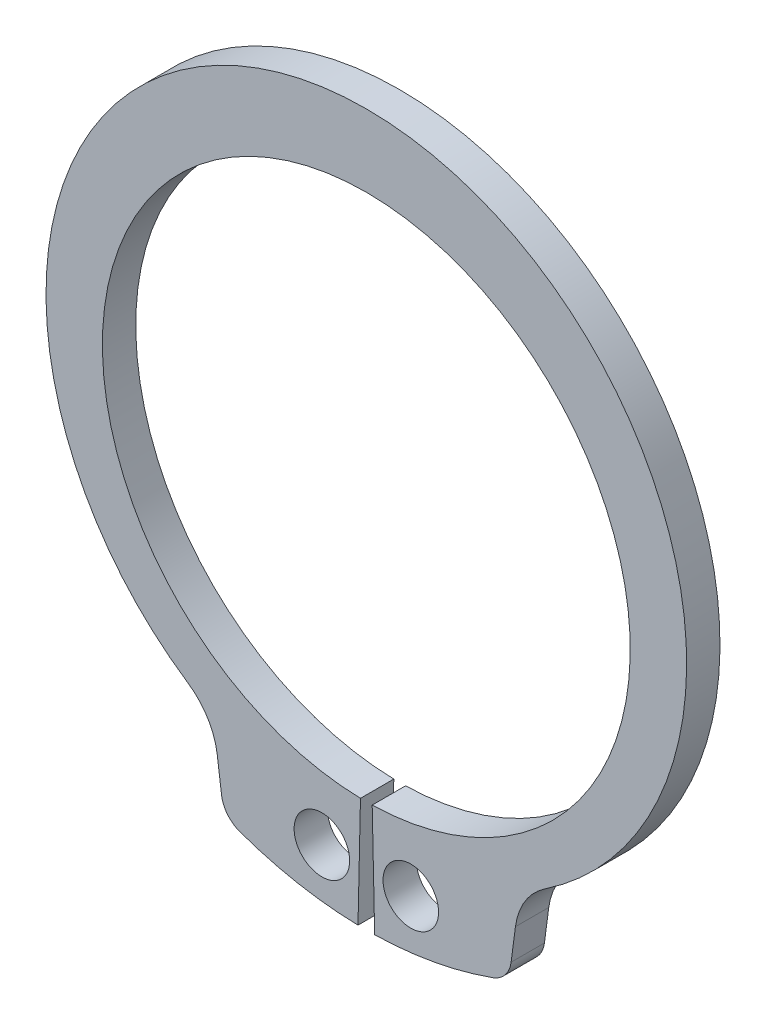
ISO-10303-21;
HEADER;
FILE_DESCRIPTION(('STEP AP214'),'2;1');
FILE_NAME('part.step','',(''),(''),'','','');
FILE_SCHEMA(('AUTOMOTIVE_DESIGN { 1 0 10303 214 1 1 1 1 }'));
ENDSEC;
DATA;
#1=APPLICATION_CONTEXT('core data for automotive mechanical design processes');
#2=APPLICATION_PROTOCOL_DEFINITION('international standard','automotive_design',2000,#1);
#3=PRODUCT_CONTEXT('',#1,'mechanical');
#4=PRODUCT('Part','Part','',(#3));
#5=PRODUCT_RELATED_PRODUCT_CATEGORY('part','',(#4));
#6=PRODUCT_DEFINITION_FORMATION('','',#4);
#7=PRODUCT_DEFINITION_CONTEXT('part definition',#1,'design');
#8=PRODUCT_DEFINITION('design','',#6,#7);
#9=PRODUCT_DEFINITION_SHAPE('','',#8);
#10=(LENGTH_UNIT() NAMED_UNIT(*) SI_UNIT(.MILLI.,.METRE.));
#11=(NAMED_UNIT(*) PLANE_ANGLE_UNIT() SI_UNIT($,.RADIAN.));
#12=(NAMED_UNIT(*) SI_UNIT($,.STERADIAN.) SOLID_ANGLE_UNIT());
#13=UNCERTAINTY_MEASURE_WITH_UNIT(LENGTH_MEASURE(1.E-05),#10,'distance_accuracy_value','');
#14=(GEOMETRIC_REPRESENTATION_CONTEXT(3) GLOBAL_UNCERTAINTY_ASSIGNED_CONTEXT((#13)) GLOBAL_UNIT_ASSIGNED_CONTEXT((#10,
#11,#12)) REPRESENTATION_CONTEXT('',''));
#15=CARTESIAN_POINT('',(0.,0.,0.));
#16=DIRECTION('',(0.,0.,1.));
#17=DIRECTION('',(1.,0.,0.));
#18=AXIS2_PLACEMENT_3D('',#15,#16,#17);
#19=CARTESIAN_POINT('',(0.,0.,-1.2));
#20=DIRECTION('',(0.,0.,1.));
#21=DIRECTION('',(1.,0.,0.));
#22=AXIS2_PLACEMENT_3D('',#19,#20,#21);
#23=CYLINDRICAL_SURFACE('',#22,9.5);
#24=CARTESIAN_POINT('',(0.,0.,0.));
#25=DIRECTION('',(0.,0.,-1.));
#26=DIRECTION('',(1.,0.,0.));
#27=AXIS2_PLACEMENT_3D('',#24,#25,#26);
#28=CIRCLE('',#27,9.5);
#29=CARTESIAN_POINT('',(-0.211111111111106,-9.49765403132613,0.));
#30=VERTEX_POINT('',#29);
#31=CARTESIAN_POINT('',(0.211111111111106,-9.49765403132613,0.));
#32=VERTEX_POINT('',#31);
#33=EDGE_CURVE('E157',#30,#32,#28,.T.);
#34=ORIENTED_EDGE('',*,*,#33,.F.);
#35=DIRECTION('',(0.,0.,1.));
#36=VECTOR('',#35,1.);
#37=CARTESIAN_POINT('',(-0.211111111111106,-9.49765403132613,-1.2));
#38=LINE('',#37,#36);
#39=CARTESIAN_POINT('',(-0.211111111111106,-9.49765403132613,-1.2));
#40=VERTEX_POINT('',#39);
#41=EDGE_CURVE('E11',#40,#30,#38,.T.);
#42=ORIENTED_EDGE('',*,*,#41,.F.);
#43=CARTESIAN_POINT('',(0.,0.,-1.2));
#44=DIRECTION('',(0.,0.,-1.));
#45=DIRECTION('',(1.,0.,0.));
#46=AXIS2_PLACEMENT_3D('',#43,#44,#45);
#47=CIRCLE('',#46,9.5);
#48=CARTESIAN_POINT('',(0.211111111111106,-9.49765403132613,-1.2));
#49=VERTEX_POINT('',#48);
#50=EDGE_CURVE('E190',#40,#49,#47,.T.);
#51=ORIENTED_EDGE('',*,*,#50,.T.);
#52=DIRECTION('',(0.,0.,1.));
#53=VECTOR('',#52,1.);
#54=CARTESIAN_POINT('',(0.211111111111106,-9.49765403132613,-1.2));
#55=LINE('',#54,#53);
#56=EDGE_CURVE('E39',#49,#32,#55,.T.);
#57=ORIENTED_EDGE('',*,*,#56,.T.);
#58=EDGE_LOOP('',(#34,#42,#51,#57));
#59=FACE_BOUND('',#58,.T.);
#60=ADVANCED_FACE('F36',(#59),#23,.F.);
#61=CARTESIAN_POINT('',(-0.211111111111106,-9.49765403132613,-1.2));
#62=DIRECTION('',(0.999753055929066,-0.0222222222222222,0.));
#63=DIRECTION('',(0.0222222222222222,0.999753055929066,0.));
#64=AXIS2_PLACEMENT_3D('',#61,#62,#63);
#65=PLANE('',#64);
#66=DIRECTION('',(0.0222222222222222,0.999753055929066,0.));
#67=VECTOR('',#66,1.);
#68=CARTESIAN_POINT('',(-0.211111111111106,-9.49765403132613,0.));
#69=LINE('',#68,#67);
#70=CARTESIAN_POINT('',(-0.299999999999995,-13.4966662550424,0.));
#71=VERTEX_POINT('',#70);
#72=EDGE_CURVE('E188',#71,#30,#69,.T.);
#73=ORIENTED_EDGE('',*,*,#72,.F.);
#74=DIRECTION('',(0.,0.,1.));
#75=VECTOR('',#74,1.);
#76=CARTESIAN_POINT('',(-0.299999999999995,-13.4966662550424,-1.2));
#77=LINE('',#76,#75);
#78=CARTESIAN_POINT('',(-0.299999999999995,-13.4966662550424,-1.2));
#79=VERTEX_POINT('',#78);
#80=EDGE_CURVE('E45',#79,#71,#77,.T.);
#81=ORIENTED_EDGE('',*,*,#80,.F.);
#82=DIRECTION('',(0.0222222222222222,0.999753055929066,0.));
#83=VECTOR('',#82,1.);
#84=CARTESIAN_POINT('',(-0.211111111111106,-9.49765403132613,-1.2));
#85=LINE('',#84,#83);
#86=EDGE_CURVE('E147',#79,#40,#85,.T.);
#87=ORIENTED_EDGE('',*,*,#86,.T.);
#88=ORIENTED_EDGE('',*,*,#41,.T.);
#89=EDGE_LOOP('',(#73,#81,#87,#88));
#90=FACE_BOUND('',#89,.T.);
#91=ADVANCED_FACE('F210',(#90),#65,.T.);
#92=CARTESIAN_POINT('',(0.,0.,-1.2));
#93=DIRECTION('',(0.,0.,1.));
#94=DIRECTION('',(1.,0.,0.));
#95=AXIS2_PLACEMENT_3D('',#92,#93,#94);
#96=CYLINDRICAL_SURFACE('',#95,13.5);
#97=CARTESIAN_POINT('',(0.,0.,0.));
#98=DIRECTION('',(0.,0.,1.));
#99=DIRECTION('',(1.,0.,0.));
#100=AXIS2_PLACEMENT_3D('',#97,#98,#99);
#101=CIRCLE('',#100,13.5);
#102=CARTESIAN_POINT('',(-4.55698289544468,-12.7076318364448,0.));
#103=VERTEX_POINT('',#102);
#104=EDGE_CURVE('E134',#103,#71,#101,.T.);
#105=ORIENTED_EDGE('',*,*,#104,.F.);
#106=DIRECTION('',(0.,0.,1.));
#107=VECTOR('',#106,1.);
#108=CARTESIAN_POINT('',(-4.55698289544468,-12.7076318364448,-1.2));
#109=LINE('',#108,#107);
#110=CARTESIAN_POINT('',(-4.55698289544468,-12.7076318364448,-1.2));
#111=VERTEX_POINT('',#110);
#112=EDGE_CURVE('E129',#111,#103,#109,.T.);
#113=ORIENTED_EDGE('',*,*,#112,.F.);
#114=CARTESIAN_POINT('',(0.,0.,-1.2));
#115=DIRECTION('',(0.,0.,1.));
#116=DIRECTION('',(1.,0.,0.));
#117=AXIS2_PLACEMENT_3D('',#114,#115,#116);
#118=CIRCLE('',#117,13.5);
#119=EDGE_CURVE('E132',#111,#79,#118,.T.);
#120=ORIENTED_EDGE('',*,*,#119,.T.);
#121=ORIENTED_EDGE('',*,*,#80,.T.);
#122=EDGE_LOOP('',(#105,#113,#120,#121));
#123=FACE_BOUND('',#122,.T.);
#124=ADVANCED_FACE('F131',(#123),#96,.T.);
#125=CARTESIAN_POINT('',(-4.21942860689323,-11.7663257744859,-1.2));
#126=DIRECTION('',(0.,0.,1.));
#127=DIRECTION('',(1.,0.,0.));
#128=AXIS2_PLACEMENT_3D('',#125,#126,#127);
#129=CYLINDRICAL_SURFACE('',#128,0.999999999999998);
#130=CARTESIAN_POINT('',(-4.21942860689323,-11.7663257744859,0.));
#131=DIRECTION('',(0.,0.,1.));
#132=DIRECTION('',(1.,0.,0.));
#133=AXIS2_PLACEMENT_3D('',#130,#131,#132);
#134=CIRCLE('',#133,0.999999999999998);
#135=CARTESIAN_POINT('',(-5.21087346826704,-11.896851966706,0.));
#136=VERTEX_POINT('',#135);
#137=EDGE_CURVE('E185',#136,#103,#134,.T.);
#138=ORIENTED_EDGE('',*,*,#137,.F.);
#139=DIRECTION('',(0.,0.,1.));
#140=VECTOR('',#139,1.);
#141=CARTESIAN_POINT('',(-5.21087346826704,-11.896851966706,-1.2));
#142=LINE('',#141,#140);
#143=CARTESIAN_POINT('',(-5.21087346826704,-11.896851966706,-1.2));
#144=VERTEX_POINT('',#143);
#145=EDGE_CURVE('E139',#144,#136,#142,.T.);
#146=ORIENTED_EDGE('',*,*,#145,.F.);
#147=CARTESIAN_POINT('',(-4.21942860689323,-11.7663257744859,-1.2));
#148=DIRECTION('',(0.,0.,1.));
#149=DIRECTION('',(1.,0.,0.));
#150=AXIS2_PLACEMENT_3D('',#147,#148,#149);
#151=CIRCLE('',#150,0.999999999999998);
#152=EDGE_CURVE('E145',#144,#111,#151,.T.);
#153=ORIENTED_EDGE('',*,*,#152,.T.);
#154=ORIENTED_EDGE('',*,*,#112,.T.);
#155=EDGE_LOOP('',(#138,#146,#153,#154));
#156=FACE_BOUND('',#155,.T.);
#157=ADVANCED_FACE('F149',(#156),#129,.T.);
#158=CARTESIAN_POINT('',(-5.36704769711022,-10.7105909256687,-1.2));
#159=DIRECTION('',(-0.99144486137381,-0.13052619222005,0.));
#160=DIRECTION('',(0.13052619222005,-0.991444861373811,0.));
#161=AXIS2_PLACEMENT_3D('',#158,#159,#160);
#162=PLANE('',#161);
#163=DIRECTION('',(0.13052619222005,-0.991444861373811,0.));
#164=VECTOR('',#163,1.);
#165=CARTESIAN_POINT('',(-5.36704769711022,-10.7105909256687,0.));
#166=LINE('',#165,#164);
#167=CARTESIAN_POINT('',(-5.36704769711022,-10.7105909256687,0.));
#168=VERTEX_POINT('',#167);
#169=EDGE_CURVE('E182',#168,#136,#166,.T.);
#170=ORIENTED_EDGE('',*,*,#169,.F.);
#171=DIRECTION('',(0.,0.,1.));
#172=VECTOR('',#171,1.);
#173=CARTESIAN_POINT('',(-5.36704769711022,-10.7105909256687,-1.2));
#174=LINE('',#173,#172);
#175=CARTESIAN_POINT('',(-5.36704769711022,-10.7105909256687,-1.2));
#176=VERTEX_POINT('',#175);
#177=EDGE_CURVE('E194',#176,#168,#174,.T.);
#178=ORIENTED_EDGE('',*,*,#177,.F.);
#179=DIRECTION('',(0.13052619222005,-0.991444861373811,0.));
#180=VECTOR('',#179,1.);
#181=CARTESIAN_POINT('',(-5.36704769711022,-10.7105909256687,-1.2));
#182=LINE('',#181,#180);
#183=EDGE_CURVE('E150',#176,#144,#182,.T.);
#184=ORIENTED_EDGE('',*,*,#183,.T.);
#185=ORIENTED_EDGE('',*,*,#145,.T.);
#186=EDGE_LOOP('',(#170,#178,#184,#185));
#187=FACE_BOUND('',#186,.T.);
#188=ADVANCED_FACE('F223',(#187),#162,.T.);
#189=CARTESIAN_POINT('',(-7.78536213111475,-11.028968060857,-1.2));
#190=DIRECTION('',(0.,0.,1.));
#191=DIRECTION('',(1.,0.,0.));
#192=AXIS2_PLACEMENT_3D('',#189,#190,#191);
#193=CYLINDRICAL_SURFACE('',#192,2.43918197392597);
#194=CARTESIAN_POINT('',(-7.78536213111475,-11.028968060857,0.));
#195=DIRECTION('',(0.,0.,-1.));
#196=DIRECTION('',(1.,0.,0.));
#197=AXIS2_PLACEMENT_3D('',#194,#195,#196);
#198=CIRCLE('',#197,2.43918197392597);
#199=CARTESIAN_POINT('',(-6.42596596916006,-9.00371479847517,0.));
#200=VERTEX_POINT('',#199);
#201=EDGE_CURVE('E179',#200,#168,#198,.T.);
#202=ORIENTED_EDGE('',*,*,#201,.F.);
#203=DIRECTION('',(0.,0.,1.));
#204=VECTOR('',#203,1.);
#205=CARTESIAN_POINT('',(-6.42596596916006,-9.00371479847517,-1.2));
#206=LINE('',#205,#204);
#207=CARTESIAN_POINT('',(-6.42596596916006,-9.00371479847517,-1.2));
#208=VERTEX_POINT('',#207);
#209=EDGE_CURVE('E196',#208,#200,#206,.T.);
#210=ORIENTED_EDGE('',*,*,#209,.F.);
#211=CARTESIAN_POINT('',(-7.78536213111475,-11.028968060857,-1.2));
#212=DIRECTION('',(0.,0.,-1.));
#213=DIRECTION('',(1.,0.,0.));
#214=AXIS2_PLACEMENT_3D('',#211,#212,#213);
#215=CIRCLE('',#214,2.43918197392597);
#216=EDGE_CURVE('E152',#208,#176,#215,.T.);
#217=ORIENTED_EDGE('',*,*,#216,.T.);
#218=ORIENTED_EDGE('',*,*,#177,.T.);
#219=EDGE_LOOP('',(#202,#210,#217,#218));
#220=FACE_BOUND('',#219,.T.);
#221=ADVANCED_FACE('F226',(#220),#193,.F.);
#222=CARTESIAN_POINT('',(0.,0.569806818860485,-1.2));
#223=DIRECTION('',(0.,0.,1.));
#224=DIRECTION('',(1.,0.,0.));
#225=AXIS2_PLACEMENT_3D('',#222,#223,#224);
#226=CYLINDRICAL_SURFACE('',#225,11.5301931811395);
#227=CARTESIAN_POINT('',(0.,0.569806818860485,0.));
#228=DIRECTION('',(0.,0.,1.));
#229=DIRECTION('',(1.,0.,0.));
#230=AXIS2_PLACEMENT_3D('',#227,#228,#229);
#231=CIRCLE('',#230,11.5301931811395);
#232=CARTESIAN_POINT('',(6.42596596916006,-9.00371479847517,0.));
#233=VERTEX_POINT('',#232);
#234=EDGE_CURVE('E176',#233,#200,#231,.T.);
#235=ORIENTED_EDGE('',*,*,#234,.F.);
#236=DIRECTION('',(0.,0.,1.));
#237=VECTOR('',#236,1.);
#238=CARTESIAN_POINT('',(6.42596596916006,-9.00371479847517,-1.2));
#239=LINE('',#238,#237);
#240=CARTESIAN_POINT('',(6.42596596916006,-9.00371479847517,-1.2));
#241=VERTEX_POINT('',#240);
#242=EDGE_CURVE('E198',#241,#233,#239,.T.);
#243=ORIENTED_EDGE('',*,*,#242,.F.);
#244=CARTESIAN_POINT('',(0.,0.569806818860485,-1.2));
#245=DIRECTION('',(0.,0.,1.));
#246=DIRECTION('',(1.,0.,0.));
#247=AXIS2_PLACEMENT_3D('',#244,#245,#246);
#248=CIRCLE('',#247,11.5301931811395);
#249=EDGE_CURVE('E300',#241,#208,#248,.T.);
#250=ORIENTED_EDGE('',*,*,#249,.T.);
#251=ORIENTED_EDGE('',*,*,#209,.T.);
#252=EDGE_LOOP('',(#235,#243,#250,#251));
#253=FACE_BOUND('',#252,.T.);
#254=ADVANCED_FACE('F230',(#253),#226,.T.);
#255=CARTESIAN_POINT('',(7.78536213111475,-11.028968060857,-1.2));
#256=DIRECTION('',(0.,0.,1.));
#257=DIRECTION('',(1.,0.,0.));
#258=AXIS2_PLACEMENT_3D('',#255,#256,#257);
#259=CYLINDRICAL_SURFACE('',#258,2.43918197392597);
#260=CARTESIAN_POINT('',(7.78536213111475,-11.028968060857,0.));
#261=DIRECTION('',(0.,0.,-1.));
#262=DIRECTION('',(1.,0.,0.));
#263=AXIS2_PLACEMENT_3D('',#260,#261,#262);
#264=CIRCLE('',#263,2.43918197392597);
#265=CARTESIAN_POINT('',(5.36704769711022,-10.7105909256687,0.));
#266=VERTEX_POINT('',#265);
#267=EDGE_CURVE('E173',#266,#233,#264,.T.);
#268=ORIENTED_EDGE('',*,*,#267,.F.);
#269=DIRECTION('',(0.,0.,1.));
#270=VECTOR('',#269,1.);
#271=CARTESIAN_POINT('',(5.36704769711022,-10.7105909256687,-1.2));
#272=LINE('',#271,#270);
#273=CARTESIAN_POINT('',(5.36704769711022,-10.7105909256687,-1.2));
#274=VERTEX_POINT('',#273);
#275=EDGE_CURVE('E200',#274,#266,#272,.T.);
#276=ORIENTED_EDGE('',*,*,#275,.F.);
#277=CARTESIAN_POINT('',(7.78536213111475,-11.028968060857,-1.2));
#278=DIRECTION('',(0.,0.,-1.));
#279=DIRECTION('',(1.,0.,0.));
#280=AXIS2_PLACEMENT_3D('',#277,#278,#279);
#281=CIRCLE('',#280,2.43918197392597);
#282=EDGE_CURVE('E297',#274,#241,#281,.T.);
#283=ORIENTED_EDGE('',*,*,#282,.T.);
#284=ORIENTED_EDGE('',*,*,#242,.T.);
#285=EDGE_LOOP('',(#268,#276,#283,#284));
#286=FACE_BOUND('',#285,.T.);
#287=ADVANCED_FACE('F234',(#286),#259,.F.);
#288=CARTESIAN_POINT('',(5.36704769711022,-10.7105909256687,-1.2));
#289=DIRECTION('',(0.99144486137381,-0.13052619222005,0.));
#290=DIRECTION('',(0.13052619222005,0.991444861373811,0.));
#291=AXIS2_PLACEMENT_3D('',#288,#289,#290);
#292=PLANE('',#291);
#293=DIRECTION('',(0.13052619222005,0.991444861373811,0.));
#294=VECTOR('',#293,1.);
#295=CARTESIAN_POINT('',(5.36704769711022,-10.7105909256687,0.));
#296=LINE('',#295,#294);
#297=CARTESIAN_POINT('',(5.21087346826704,-11.896851966706,0.));
#298=VERTEX_POINT('',#297);
#299=EDGE_CURVE('E170',#298,#266,#296,.T.);
#300=ORIENTED_EDGE('',*,*,#299,.F.);
#301=DIRECTION('',(0.,0.,1.));
#302=VECTOR('',#301,1.);
#303=CARTESIAN_POINT('',(5.21087346826704,-11.896851966706,-1.2));
#304=LINE('',#303,#302);
#305=CARTESIAN_POINT('',(5.21087346826704,-11.896851966706,-1.2));
#306=VERTEX_POINT('',#305);
#307=EDGE_CURVE('E202',#306,#298,#304,.T.);
#308=ORIENTED_EDGE('',*,*,#307,.F.);
#309=DIRECTION('',(0.13052619222005,0.991444861373811,0.));
#310=VECTOR('',#309,1.);
#311=CARTESIAN_POINT('',(5.36704769711022,-10.7105909256687,-1.2));
#312=LINE('',#311,#310);
#313=EDGE_CURVE('E294',#306,#274,#312,.T.);
#314=ORIENTED_EDGE('',*,*,#313,.T.);
#315=ORIENTED_EDGE('',*,*,#275,.T.);
#316=EDGE_LOOP('',(#300,#308,#314,#315));
#317=FACE_BOUND('',#316,.T.);
#318=ADVANCED_FACE('F238',(#317),#292,.T.);
#319=CARTESIAN_POINT('',(4.21942860689323,-11.7663257744859,-1.2));
#320=DIRECTION('',(0.,0.,1.));
#321=DIRECTION('',(1.,0.,0.));
#322=AXIS2_PLACEMENT_3D('',#319,#320,#321);
#323=CYLINDRICAL_SURFACE('',#322,0.999999999999998);
#324=CARTESIAN_POINT('',(4.21942860689323,-11.7663257744859,0.));
#325=DIRECTION('',(0.,0.,1.));
#326=DIRECTION('',(-1.,0.,0.));
#327=AXIS2_PLACEMENT_3D('',#324,#325,#326);
#328=CIRCLE('',#327,0.999999999999998);
#329=CARTESIAN_POINT('',(4.55698289544468,-12.7076318364448,0.));
#330=VERTEX_POINT('',#329);
#331=EDGE_CURVE('E167',#330,#298,#328,.T.);
#332=ORIENTED_EDGE('',*,*,#331,.F.);
#333=DIRECTION('',(0.,0.,1.));
#334=VECTOR('',#333,1.);
#335=CARTESIAN_POINT('',(4.55698289544468,-12.7076318364448,-1.2));
#336=LINE('',#335,#334);
#337=CARTESIAN_POINT('',(4.55698289544468,-12.7076318364448,-1.2));
#338=VERTEX_POINT('',#337);
#339=EDGE_CURVE('E204',#338,#330,#336,.T.);
#340=ORIENTED_EDGE('',*,*,#339,.F.);
#341=CARTESIAN_POINT('',(4.21942860689323,-11.7663257744859,-1.2));
#342=DIRECTION('',(0.,0.,1.));
#343=DIRECTION('',(-1.,0.,0.));
#344=AXIS2_PLACEMENT_3D('',#341,#342,#343);
#345=CIRCLE('',#344,0.999999999999998);
#346=EDGE_CURVE('E291',#338,#306,#345,.T.);
#347=ORIENTED_EDGE('',*,*,#346,.T.);
#348=ORIENTED_EDGE('',*,*,#307,.T.);
#349=EDGE_LOOP('',(#332,#340,#347,#348));
#350=FACE_BOUND('',#349,.T.);
#351=ADVANCED_FACE('F242',(#350),#323,.T.);
#352=CARTESIAN_POINT('',(0.,0.,-1.2));
#353=DIRECTION('',(0.,0.,1.));
#354=DIRECTION('',(1.,0.,0.));
#355=AXIS2_PLACEMENT_3D('',#352,#353,#354);
#356=CYLINDRICAL_SURFACE('',#355,13.5);
#357=CARTESIAN_POINT('',(0.,0.,0.));
#358=DIRECTION('',(0.,0.,1.));
#359=DIRECTION('',(1.,0.,0.));
#360=AXIS2_PLACEMENT_3D('',#357,#358,#359);
#361=CIRCLE('',#360,13.5);
#362=CARTESIAN_POINT('',(0.299999999999995,-13.4966662550424,0.));
#363=VERTEX_POINT('',#362);
#364=EDGE_CURVE('E164',#363,#330,#361,.T.);
#365=ORIENTED_EDGE('',*,*,#364,.F.);
#366=DIRECTION('',(0.,0.,1.));
#367=VECTOR('',#366,1.);
#368=CARTESIAN_POINT('',(0.299999999999995,-13.4966662550424,-1.2));
#369=LINE('',#368,#367);
#370=CARTESIAN_POINT('',(0.299999999999995,-13.4966662550424,-1.2));
#371=VERTEX_POINT('',#370);
#372=EDGE_CURVE('E205',#371,#363,#369,.T.);
#373=ORIENTED_EDGE('',*,*,#372,.F.);
#374=CARTESIAN_POINT('',(0.,0.,-1.2));
#375=DIRECTION('',(0.,0.,1.));
#376=DIRECTION('',(1.,0.,0.));
#377=AXIS2_PLACEMENT_3D('',#374,#375,#376);
#378=CIRCLE('',#377,13.5);
#379=EDGE_CURVE('E288',#371,#338,#378,.T.);
#380=ORIENTED_EDGE('',*,*,#379,.T.);
#381=ORIENTED_EDGE('',*,*,#339,.T.);
#382=EDGE_LOOP('',(#365,#373,#380,#381));
#383=FACE_BOUND('',#382,.T.);
#384=ADVANCED_FACE('F246',(#383),#356,.T.);
#385=CARTESIAN_POINT('',(0.211111111111106,-9.49765403132613,-1.2));
#386=DIRECTION('',(-0.999753055929066,-0.0222222222222222,0.));
#387=DIRECTION('',(0.0222222222222222,-0.999753055929066,0.));
#388=AXIS2_PLACEMENT_3D('',#385,#386,#387);
#389=PLANE('',#388);
#390=DIRECTION('',(0.0222222222222222,-0.999753055929066,0.));
#391=VECTOR('',#390,1.);
#392=CARTESIAN_POINT('',(0.211111111111106,-9.49765403132613,0.));
#393=LINE('',#392,#391);
#394=EDGE_CURVE('E160',#32,#363,#393,.T.);
#395=ORIENTED_EDGE('',*,*,#394,.F.);
#396=ORIENTED_EDGE('',*,*,#56,.F.);
#397=DIRECTION('',(0.0222222222222222,-0.999753055929066,0.));
#398=VECTOR('',#397,1.);
#399=CARTESIAN_POINT('',(0.211111111111106,-9.49765403132613,-1.2));
#400=LINE('',#399,#398);
#401=EDGE_CURVE('E286',#49,#371,#400,.T.);
#402=ORIENTED_EDGE('',*,*,#401,.T.);
#403=ORIENTED_EDGE('',*,*,#372,.T.);
#404=EDGE_LOOP('',(#395,#396,#402,#403));
#405=FACE_BOUND('',#404,.T.);
#406=ADVANCED_FACE('F207',(#405),#389,.T.);
#407=CARTESIAN_POINT('',(0.,0.,-1.2));
#408=DIRECTION('',(0.,0.,1.));
#409=DIRECTION('',(1.,0.,0.));
#410=AXIS2_PLACEMENT_3D('',#407,#408,#409);
#411=PLANE('',#410);
#412=CARTESIAN_POINT('',(-1.59999999999999,-11.6405541105224,-1.2));
#413=DIRECTION('',(0.,0.,1.));
#414=DIRECTION('',(1.,0.,0.));
#415=AXIS2_PLACEMENT_3D('',#412,#413,#414);
#416=CIRCLE('',#415,1.);
#417=CARTESIAN_POINT('',(-0.59999999999999,-11.6405541105224,-1.2));
#418=VERTEX_POINT('',#417);
#419=EDGE_CURVE('E273',#418,#418,#416,.T.);
#420=ORIENTED_EDGE('',*,*,#419,.T.);
#421=EDGE_LOOP('',(#420));
#422=FACE_BOUND('',#421,.T.);
#423=CARTESIAN_POINT('',(1.59999999999999,-11.6405541105224,-1.2));
#424=DIRECTION('',(0.,0.,1.));
#425=DIRECTION('',(1.,0.,0.));
#426=AXIS2_PLACEMENT_3D('',#423,#424,#425);
#427=CIRCLE('',#426,1.);
#428=CARTESIAN_POINT('',(2.59999999999999,-11.6405541105224,-1.2));
#429=VERTEX_POINT('',#428);
#430=EDGE_CURVE('E161',#429,#429,#427,.T.);
#431=ORIENTED_EDGE('',*,*,#430,.T.);
#432=EDGE_LOOP('',(#431));
#433=FACE_BOUND('',#432,.T.);
#434=ORIENTED_EDGE('',*,*,#50,.F.);
#435=ORIENTED_EDGE('',*,*,#86,.F.);
#436=ORIENTED_EDGE('',*,*,#119,.F.);
#437=ORIENTED_EDGE('',*,*,#152,.F.);
#438=ORIENTED_EDGE('',*,*,#183,.F.);
#439=ORIENTED_EDGE('',*,*,#216,.F.);
#440=ORIENTED_EDGE('',*,*,#249,.F.);
#441=ORIENTED_EDGE('',*,*,#282,.F.);
#442=ORIENTED_EDGE('',*,*,#313,.F.);
#443=ORIENTED_EDGE('',*,*,#346,.F.);
#444=ORIENTED_EDGE('',*,*,#379,.F.);
#445=ORIENTED_EDGE('',*,*,#401,.F.);
#446=EDGE_LOOP('',(#434,#435,#436,#437,#438,#439,#440,#441,#442,#443,#444,#445));
#447=FACE_BOUND('',#446,.T.);
#448=ADVANCED_FACE('F143',(#422,#433,#447),#411,.F.);
#449=CARTESIAN_POINT('',(0.,0.,0.));
#450=DIRECTION('',(0.,0.,1.));
#451=DIRECTION('',(1.,0.,0.));
#452=AXIS2_PLACEMENT_3D('',#449,#450,#451);
#453=PLANE('',#452);
#454=CARTESIAN_POINT('',(-1.59999999999999,-11.6405541105224,0.));
#455=DIRECTION('',(0.,0.,1.));
#456=DIRECTION('',(1.,0.,0.));
#457=AXIS2_PLACEMENT_3D('',#454,#455,#456);
#458=CIRCLE('',#457,1.);
#459=CARTESIAN_POINT('',(-0.59999999999999,-11.6405541105224,0.));
#460=VERTEX_POINT('',#459);
#461=EDGE_CURVE('E276',#460,#460,#458,.T.);
#462=ORIENTED_EDGE('',*,*,#461,.F.);
#463=EDGE_LOOP('',(#462));
#464=FACE_BOUND('',#463,.T.);
#465=CARTESIAN_POINT('',(1.59999999999999,-11.6405541105224,0.));
#466=DIRECTION('',(0.,0.,1.));
#467=DIRECTION('',(1.,0.,0.));
#468=AXIS2_PLACEMENT_3D('',#465,#466,#467);
#469=CIRCLE('',#468,1.);
#470=CARTESIAN_POINT('',(2.59999999999999,-11.6405541105224,0.));
#471=VERTEX_POINT('',#470);
#472=EDGE_CURVE('E278',#471,#471,#469,.T.);
#473=ORIENTED_EDGE('',*,*,#472,.F.);
#474=EDGE_LOOP('',(#473));
#475=FACE_BOUND('',#474,.T.);
#476=ORIENTED_EDGE('',*,*,#33,.T.);
#477=ORIENTED_EDGE('',*,*,#394,.T.);
#478=ORIENTED_EDGE('',*,*,#364,.T.);
#479=ORIENTED_EDGE('',*,*,#331,.T.);
#480=ORIENTED_EDGE('',*,*,#299,.T.);
#481=ORIENTED_EDGE('',*,*,#267,.T.);
#482=ORIENTED_EDGE('',*,*,#234,.T.);
#483=ORIENTED_EDGE('',*,*,#201,.T.);
#484=ORIENTED_EDGE('',*,*,#169,.T.);
#485=ORIENTED_EDGE('',*,*,#137,.T.);
#486=ORIENTED_EDGE('',*,*,#104,.T.);
#487=ORIENTED_EDGE('',*,*,#72,.T.);
#488=EDGE_LOOP('',(#476,#477,#478,#479,#480,#481,#482,#483,#484,#485,#486,#487));
#489=FACE_BOUND('',#488,.T.);
#490=ADVANCED_FACE('F209',(#464,#475,#489),#453,.T.);
#491=CARTESIAN_POINT('',(1.59999999999999,-11.6405541105224,-1.2));
#492=DIRECTION('',(0.,0.,1.));
#493=DIRECTION('',(1.,0.,0.));
#494=AXIS2_PLACEMENT_3D('',#491,#492,#493);
#495=CYLINDRICAL_SURFACE('',#494,1.);
#496=ORIENTED_EDGE('',*,*,#430,.F.);
#497=EDGE_LOOP('',(#496));
#498=FACE_BOUND('',#497,.T.);
#499=ORIENTED_EDGE('',*,*,#472,.T.);
#500=EDGE_LOOP('',(#499));
#501=FACE_BOUND('',#500,.T.);
#502=ADVANCED_FACE('F258',(#498,#501),#495,.F.);
#503=CARTESIAN_POINT('',(-1.59999999999999,-11.6405541105224,-1.2));
#504=DIRECTION('',(0.,0.,1.));
#505=DIRECTION('',(1.,0.,0.));
#506=AXIS2_PLACEMENT_3D('',#503,#504,#505);
#507=CYLINDRICAL_SURFACE('',#506,1.);
#508=ORIENTED_EDGE('',*,*,#419,.F.);
#509=EDGE_LOOP('',(#508));
#510=FACE_BOUND('',#509,.T.);
#511=ORIENTED_EDGE('',*,*,#461,.T.);
#512=EDGE_LOOP('',(#511));
#513=FACE_BOUND('',#512,.T.);
#514=ADVANCED_FACE('F265',(#510,#513),#507,.F.);
#515=CLOSED_SHELL('',(#60,#91,#124,#157,#188,#221,#254,#287,#318,#351,#384,#406,#448,#490,#502,#514));
#516=MANIFOLD_SOLID_BREP('B2',#515);
#517=ADVANCED_BREP_SHAPE_REPRESENTATION('',(#18,#516),#14);
#518=SHAPE_DEFINITION_REPRESENTATION(#9,#517);
ENDSEC;
END-ISO-10303-21;
